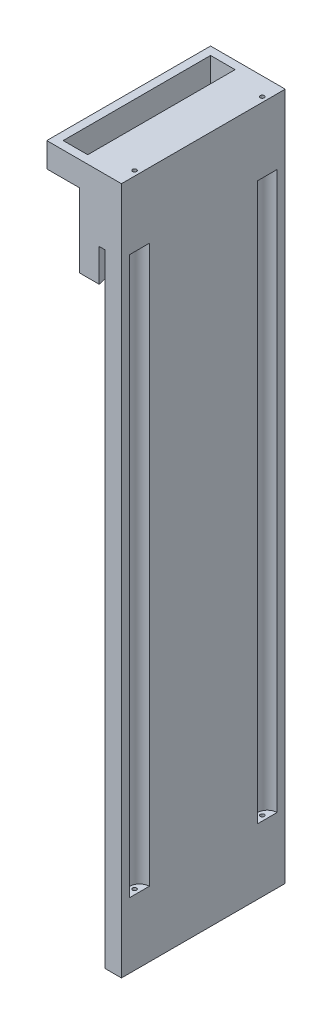
ISO-10303-21;
HEADER;
FILE_DESCRIPTION(('STEP AP214'),'2;1');
FILE_NAME('part.step','',(''),(''),'','','');
FILE_SCHEMA(('AUTOMOTIVE_DESIGN { 1 0 10303 214 1 1 1 1 }'));
ENDSEC;
DATA;
#1=APPLICATION_CONTEXT('core data for automotive mechanical design processes');
#2=APPLICATION_PROTOCOL_DEFINITION('international standard','automotive_design',2000,#1);
#3=PRODUCT_CONTEXT('',#1,'mechanical');
#4=PRODUCT('Part','Part','',(#3));
#5=PRODUCT_RELATED_PRODUCT_CATEGORY('part','',(#4));
#6=PRODUCT_DEFINITION_FORMATION('','',#4);
#7=PRODUCT_DEFINITION_CONTEXT('part definition',#1,'design');
#8=PRODUCT_DEFINITION('design','',#6,#7);
#9=PRODUCT_DEFINITION_SHAPE('','',#8);
#10=(LENGTH_UNIT() NAMED_UNIT(*) SI_UNIT(.MILLI.,.METRE.));
#11=(NAMED_UNIT(*) PLANE_ANGLE_UNIT() SI_UNIT($,.RADIAN.));
#12=(NAMED_UNIT(*) SI_UNIT($,.STERADIAN.) SOLID_ANGLE_UNIT());
#13=UNCERTAINTY_MEASURE_WITH_UNIT(LENGTH_MEASURE(1.E-05),#10,'distance_accuracy_value','');
#14=(GEOMETRIC_REPRESENTATION_CONTEXT(3) GLOBAL_UNCERTAINTY_ASSIGNED_CONTEXT((#13)) GLOBAL_UNIT_ASSIGNED_CONTEXT((#10,
#11,#12)) REPRESENTATION_CONTEXT('',''));
#15=CARTESIAN_POINT('',(0.,0.,0.));
#16=DIRECTION('',(0.,0.,1.));
#17=DIRECTION('',(1.,0.,0.));
#18=AXIS2_PLACEMENT_3D('',#15,#16,#17);
#19=CARTESIAN_POINT('',(0.,0.,50.));
#20=DIRECTION('',(1.,0.,0.));
#21=DIRECTION('',(0.,0.,-1.));
#22=AXIS2_PLACEMENT_3D('',#19,#20,#21);
#23=PLANE('',#22);
#24=DIRECTION('',(0.,0.,1.));
#25=VECTOR('',#24,1.);
#26=CARTESIAN_POINT('',(0.,22.5,0.));
#27=LINE('',#26,#25);
#28=CARTESIAN_POINT('',(0.,22.5,0.));
#29=VERTEX_POINT('',#28);
#30=CARTESIAN_POINT('',(0.,22.5,2.5));
#31=VERTEX_POINT('',#30);
#32=EDGE_CURVE('E251',#29,#31,#27,.T.);
#33=ORIENTED_EDGE('',*,*,#32,.F.);
#34=DIRECTION('',(0.,-1.,0.));
#35=VECTOR('',#34,1.);
#36=CARTESIAN_POINT('',(0.,0.,0.));
#37=LINE('',#36,#35);
#38=CARTESIAN_POINT('',(0.,0.,0.));
#39=VERTEX_POINT('',#38);
#40=EDGE_CURVE('E289',#29,#39,#37,.T.);
#41=ORIENTED_EDGE('',*,*,#40,.T.);
#42=DIRECTION('',(0.,0.,-1.));
#43=VECTOR('',#42,1.);
#44=CARTESIAN_POINT('',(0.,0.,50.));
#45=LINE('',#44,#43);
#46=CARTESIAN_POINT('',(0.,0.,50.));
#47=VERTEX_POINT('',#46);
#48=EDGE_CURVE('E302',#47,#39,#45,.T.);
#49=ORIENTED_EDGE('',*,*,#48,.F.);
#50=DIRECTION('',(0.,-1.,0.));
#51=VECTOR('',#50,1.);
#52=CARTESIAN_POINT('',(0.,0.,50.));
#53=LINE('',#52,#51);
#54=CARTESIAN_POINT('',(0.,22.5,50.));
#55=VERTEX_POINT('',#54);
#56=EDGE_CURVE('E300',#55,#47,#53,.T.);
#57=ORIENTED_EDGE('',*,*,#56,.F.);
#58=CARTESIAN_POINT('',(0.,22.5,47.5));
#59=VERTEX_POINT('',#58);
#60=EDGE_CURVE('E246',#59,#55,#27,.T.);
#61=ORIENTED_EDGE('',*,*,#60,.F.);
#62=DIRECTION('',(0.,-1.,0.));
#63=VECTOR('',#62,1.);
#64=CARTESIAN_POINT('',(0.,32.5,47.5));
#65=LINE('',#64,#63);
#66=CARTESIAN_POINT('',(0.,30.,47.5));
#67=VERTEX_POINT('',#66);
#68=EDGE_CURVE('E226',#67,#59,#65,.T.);
#69=ORIENTED_EDGE('',*,*,#68,.F.);
#70=DIRECTION('',(0.,0.,1.));
#71=VECTOR('',#70,1.);
#72=CARTESIAN_POINT('',(0.,30.,50.));
#73=LINE('',#72,#71);
#74=CARTESIAN_POINT('',(0.,30.,2.5));
#75=VERTEX_POINT('',#74);
#76=EDGE_CURVE('E243',#75,#67,#73,.T.);
#77=ORIENTED_EDGE('',*,*,#76,.F.);
#78=DIRECTION('',(0.,-1.,0.));
#79=VECTOR('',#78,1.);
#80=CARTESIAN_POINT('',(0.,32.5,2.5));
#81=LINE('',#80,#79);
#82=EDGE_CURVE('E227',#75,#31,#81,.T.);
#83=ORIENTED_EDGE('',*,*,#82,.T.);
#84=EDGE_LOOP('',(#33,#41,#49,#57,#61,#69,#77,#83));
#85=FACE_BOUND('',#84,.T.);
#86=ADVANCED_FACE('F41',(#85),#23,.F.);
#87=CARTESIAN_POINT('',(6.,0.,50.));
#88=DIRECTION('',(0.,1.,0.));
#89=DIRECTION('',(-1.,0.,0.));
#90=AXIS2_PLACEMENT_3D('',#87,#88,#89);
#91=PLANE('',#90);
#92=DIRECTION('',(1.,0.,0.));
#93=VECTOR('',#92,1.);
#94=CARTESIAN_POINT('',(6.,0.,0.));
#95=LINE('',#94,#93);
#96=CARTESIAN_POINT('',(6.,0.,0.));
#97=VERTEX_POINT('',#96);
#98=EDGE_CURVE('E284',#39,#97,#95,.T.);
#99=ORIENTED_EDGE('',*,*,#98,.T.);
#100=CARTESIAN_POINT('',(99.3089491956693,0.,25.));
#101=DIRECTION('',(0.,-1.,0.));
#102=DIRECTION('',(1.,0.,0.));
#103=AXIS2_PLACEMENT_3D('',#100,#101,#102);
#104=CIRCLE('',#103,96.6);
#105=CARTESIAN_POINT('',(6.,0.,50.));
#106=VERTEX_POINT('',#105);
#107=EDGE_CURVE('E267',#106,#97,#104,.T.);
#108=ORIENTED_EDGE('',*,*,#107,.F.);
#109=DIRECTION('',(1.,0.,0.));
#110=VECTOR('',#109,1.);
#111=CARTESIAN_POINT('',(6.,0.,50.));
#112=LINE('',#111,#110);
#113=EDGE_CURVE('E285',#47,#106,#112,.T.);
#114=ORIENTED_EDGE('',*,*,#113,.F.);
#115=ORIENTED_EDGE('',*,*,#48,.T.);
#116=EDGE_LOOP('',(#99,#108,#114,#115));
#117=FACE_BOUND('',#116,.T.);
#118=ADVANCED_FACE('F43',(#117),#91,.F.);
#119=CARTESIAN_POINT('',(7.8,10.,50.));
#120=DIRECTION('',(0.,1.,0.));
#121=DIRECTION('',(-1.,0.,0.));
#122=AXIS2_PLACEMENT_3D('',#119,#120,#121);
#123=PLANE('',#122);
#124=DIRECTION('',(1.,0.,0.));
#125=VECTOR('',#124,1.);
#126=CARTESIAN_POINT('',(7.8,10.,0.));
#127=LINE('',#126,#125);
#128=CARTESIAN_POINT('',(6.,10.,0.));
#129=VERTEX_POINT('',#128);
#130=CARTESIAN_POINT('',(7.8,10.,0.));
#131=VERTEX_POINT('',#130);
#132=EDGE_CURVE('E307',#129,#131,#127,.T.);
#133=ORIENTED_EDGE('',*,*,#132,.T.);
#134=DIRECTION('',(0.,0.,-1.));
#135=VECTOR('',#134,1.);
#136=CARTESIAN_POINT('',(7.8,10.,50.));
#137=LINE('',#136,#135);
#138=CARTESIAN_POINT('',(7.8,10.,50.));
#139=VERTEX_POINT('',#138);
#140=EDGE_CURVE('E11',#139,#131,#137,.T.);
#141=ORIENTED_EDGE('',*,*,#140,.F.);
#142=DIRECTION('',(1.,0.,0.));
#143=VECTOR('',#142,1.);
#144=CARTESIAN_POINT('',(7.8,10.,50.));
#145=LINE('',#144,#143);
#146=CARTESIAN_POINT('',(6.,10.,50.));
#147=VERTEX_POINT('',#146);
#148=EDGE_CURVE('E292',#147,#139,#145,.T.);
#149=ORIENTED_EDGE('',*,*,#148,.F.);
#150=CARTESIAN_POINT('',(99.3089491956693,10.,25.));
#151=DIRECTION('',(0.,-1.,0.));
#152=DIRECTION('',(1.,0.,0.));
#153=AXIS2_PLACEMENT_3D('',#150,#151,#152);
#154=CIRCLE('',#153,96.6);
#155=EDGE_CURVE('E268',#147,#129,#154,.T.);
#156=ORIENTED_EDGE('',*,*,#155,.T.);
#157=EDGE_LOOP('',(#133,#141,#149,#156));
#158=FACE_BOUND('',#157,.T.);
#159=ADVANCED_FACE('F347',(#158),#123,.F.);
#160=CARTESIAN_POINT('',(7.8,0.,50.));
#161=DIRECTION('',(1.,0.,0.));
#162=DIRECTION('',(0.,0.,-1.));
#163=AXIS2_PLACEMENT_3D('',#160,#161,#162);
#164=PLANE('',#163);
#165=DIRECTION('',(0.,-1.,0.));
#166=VECTOR('',#165,1.);
#167=CARTESIAN_POINT('',(7.8,0.,0.));
#168=LINE('',#167,#166);
#169=CARTESIAN_POINT('',(7.80000000000001,-180.,0.));
#170=VERTEX_POINT('',#169);
#171=EDGE_CURVE('E309',#131,#170,#168,.T.);
#172=ORIENTED_EDGE('',*,*,#171,.T.);
#173=DIRECTION('',(0.,0.,-1.));
#174=VECTOR('',#173,1.);
#175=CARTESIAN_POINT('',(7.80000000000001,-180.,0.));
#176=LINE('',#175,#174);
#177=CARTESIAN_POINT('',(7.80000000000001,-180.,50.));
#178=VERTEX_POINT('',#177);
#179=EDGE_CURVE('E271',#178,#170,#176,.T.);
#180=ORIENTED_EDGE('',*,*,#179,.F.);
#181=DIRECTION('',(0.,-1.,0.));
#182=VECTOR('',#181,1.);
#183=CARTESIAN_POINT('',(7.8,0.,50.));
#184=LINE('',#183,#182);
#185=EDGE_CURVE('E294',#139,#178,#184,.T.);
#186=ORIENTED_EDGE('',*,*,#185,.F.);
#187=ORIENTED_EDGE('',*,*,#140,.T.);
#188=EDGE_LOOP('',(#172,#180,#186,#187));
#189=FACE_BOUND('',#188,.T.);
#190=ADVANCED_FACE('F360',(#189),#164,.F.);
#191=CARTESIAN_POINT('',(12.8,30.,50.));
#192=DIRECTION('',(-1.,0.,0.));
#193=DIRECTION('',(0.,-1.,0.));
#194=AXIS2_PLACEMENT_3D('',#191,#192,#193);
#195=PLANE('',#194);
#196=DIRECTION('',(0.,1.,0.));
#197=VECTOR('',#196,1.);
#198=CARTESIAN_POINT('',(12.8,-160.,2.50009450023526));
#199=LINE('',#198,#197);
#200=CARTESIAN_POINT('',(12.8,-160.,2.50009450023526));
#201=VERTEX_POINT('',#200);
#202=CARTESIAN_POINT('',(12.8,10.,2.50009450023526));
#203=VERTEX_POINT('',#202);
#204=EDGE_CURVE('E175',#201,#203,#199,.T.);
#205=ORIENTED_EDGE('',*,*,#204,.F.);
#206=DIRECTION('',(0.,0.,-1.));
#207=VECTOR('',#206,1.);
#208=CARTESIAN_POINT('',(12.8,-160.,2.50009450023526));
#209=LINE('',#208,#207);
#210=CARTESIAN_POINT('',(12.8,-160.,8.5));
#211=VERTEX_POINT('',#210);
#212=EDGE_CURVE('E176',#211,#201,#209,.T.);
#213=ORIENTED_EDGE('',*,*,#212,.F.);
#214=DIRECTION('',(0.,1.,0.));
#215=VECTOR('',#214,1.);
#216=CARTESIAN_POINT('',(12.8,-160.,8.5));
#217=LINE('',#216,#215);
#218=CARTESIAN_POINT('',(12.8,10.,8.5));
#219=VERTEX_POINT('',#218);
#220=EDGE_CURVE('E167',#211,#219,#217,.T.);
#221=ORIENTED_EDGE('',*,*,#220,.T.);
#222=DIRECTION('',(0.,0.,-1.));
#223=VECTOR('',#222,1.);
#224=CARTESIAN_POINT('',(12.8,10.,2.50009450023526));
#225=LINE('',#224,#223);
#226=EDGE_CURVE('E181',#219,#203,#225,.T.);
#227=ORIENTED_EDGE('',*,*,#226,.T.);
#228=EDGE_LOOP('',(#205,#213,#221,#227));
#229=FACE_BOUND('',#228,.T.);
#230=DIRECTION('',(0.,1.,0.));
#231=VECTOR('',#230,1.);
#232=CARTESIAN_POINT('',(12.8,-160.,41.5000945002353));
#233=LINE('',#232,#231);
#234=CARTESIAN_POINT('',(12.8,-160.,41.5000945002353));
#235=VERTEX_POINT('',#234);
#236=CARTESIAN_POINT('',(12.8,10.,41.5000945002353));
#237=VERTEX_POINT('',#236);
#238=EDGE_CURVE('E213',#235,#237,#233,.T.);
#239=ORIENTED_EDGE('',*,*,#238,.F.);
#240=DIRECTION('',(0.,0.,-1.));
#241=VECTOR('',#240,1.);
#242=CARTESIAN_POINT('',(12.8,-160.,41.5000945002353));
#243=LINE('',#242,#241);
#244=CARTESIAN_POINT('',(12.8,-160.,47.5));
#245=VERTEX_POINT('',#244);
#246=EDGE_CURVE('E205',#245,#235,#243,.T.);
#247=ORIENTED_EDGE('',*,*,#246,.F.);
#248=DIRECTION('',(0.,1.,0.));
#249=VECTOR('',#248,1.);
#250=CARTESIAN_POINT('',(12.8,-160.,47.5));
#251=LINE('',#250,#249);
#252=CARTESIAN_POINT('',(12.8,10.,47.5));
#253=VERTEX_POINT('',#252);
#254=EDGE_CURVE('E209',#245,#253,#251,.T.);
#255=ORIENTED_EDGE('',*,*,#254,.T.);
#256=DIRECTION('',(0.,0.,-1.));
#257=VECTOR('',#256,1.);
#258=CARTESIAN_POINT('',(12.8,10.,41.5000945002353));
#259=LINE('',#258,#257);
#260=EDGE_CURVE('E206',#253,#237,#259,.T.);
#261=ORIENTED_EDGE('',*,*,#260,.T.);
#262=EDGE_LOOP('',(#239,#247,#255,#261));
#263=FACE_BOUND('',#262,.T.);
#264=DIRECTION('',(0.,1.,0.));
#265=VECTOR('',#264,1.);
#266=CARTESIAN_POINT('',(12.8,30.,0.));
#267=LINE('',#266,#265);
#268=CARTESIAN_POINT('',(12.8,-180.,0.));
#269=VERTEX_POINT('',#268);
#270=CARTESIAN_POINT('',(12.8,30.,0.));
#271=VERTEX_POINT('',#270);
#272=EDGE_CURVE('E311',#269,#271,#267,.T.);
#273=ORIENTED_EDGE('',*,*,#272,.T.);
#274=DIRECTION('',(0.,0.,-1.));
#275=VECTOR('',#274,1.);
#276=CARTESIAN_POINT('',(12.8,30.,50.));
#277=LINE('',#276,#275);
#278=CARTESIAN_POINT('',(12.8,30.,50.));
#279=VERTEX_POINT('',#278);
#280=EDGE_CURVE('E50',#279,#271,#277,.T.);
#281=ORIENTED_EDGE('',*,*,#280,.F.);
#282=DIRECTION('',(0.,1.,0.));
#283=VECTOR('',#282,1.);
#284=CARTESIAN_POINT('',(12.8,30.,50.));
#285=LINE('',#284,#283);
#286=CARTESIAN_POINT('',(12.8,-180.,50.));
#287=VERTEX_POINT('',#286);
#288=EDGE_CURVE('E296',#287,#279,#285,.T.);
#289=ORIENTED_EDGE('',*,*,#288,.F.);
#290=DIRECTION('',(0.,0.,1.));
#291=VECTOR('',#290,1.);
#292=CARTESIAN_POINT('',(12.8,-180.,50.));
#293=LINE('',#292,#291);
#294=EDGE_CURVE('E278',#269,#287,#293,.T.);
#295=ORIENTED_EDGE('',*,*,#294,.F.);
#296=EDGE_LOOP('',(#273,#281,#289,#295));
#297=FACE_BOUND('',#296,.T.);
#298=ADVANCED_FACE('F183',(#229,#263,#297),#195,.F.);
#299=CARTESIAN_POINT('',(0.,30.,50.));
#300=DIRECTION('',(0.,-1.,0.));
#301=DIRECTION('',(0.,0.,-1.));
#302=AXIS2_PLACEMENT_3D('',#299,#300,#301);
#303=PLANE('',#302);
#304=CARTESIAN_POINT('',(11.3,30.,5.50000000000001));
#305=DIRECTION('',(0.,1.,0.));
#306=DIRECTION('',(0.,0.,1.));
#307=AXIS2_PLACEMENT_3D('',#304,#305,#306);
#308=CIRCLE('',#307,0.600000000000008);
#309=CARTESIAN_POINT('',(11.3,30.,6.10000000000001));
#310=VERTEX_POINT('',#309);
#311=EDGE_CURVE('E574',#310,#310,#308,.T.);
#312=ORIENTED_EDGE('',*,*,#311,.F.);
#313=EDGE_LOOP('',(#312));
#314=FACE_BOUND('',#313,.T.);
#315=CARTESIAN_POINT('',(11.3,30.,44.5));
#316=DIRECTION('',(0.,1.,0.));
#317=DIRECTION('',(0.,0.,1.));
#318=AXIS2_PLACEMENT_3D('',#315,#316,#317);
#319=CIRCLE('',#318,0.600000000000008);
#320=CARTESIAN_POINT('',(11.3,30.,45.1));
#321=VERTEX_POINT('',#320);
#322=EDGE_CURVE('E191',#321,#321,#319,.T.);
#323=ORIENTED_EDGE('',*,*,#322,.F.);
#324=EDGE_LOOP('',(#323));
#325=FACE_BOUND('',#324,.T.);
#326=DIRECTION('',(1.,0.,0.));
#327=VECTOR('',#326,1.);
#328=CARTESIAN_POINT('',(0.,30.,2.5));
#329=LINE('',#328,#327);
#330=CARTESIAN_POINT('',(-7.49999999999999,30.,2.5));
#331=VERTEX_POINT('',#330);
#332=EDGE_CURVE('E240',#331,#75,#329,.T.);
#333=ORIENTED_EDGE('',*,*,#332,.T.);
#334=ORIENTED_EDGE('',*,*,#76,.T.);
#335=DIRECTION('',(-1.,0.,0.));
#336=VECTOR('',#335,1.);
#337=CARTESIAN_POINT('',(0.,30.,47.5));
#338=LINE('',#337,#336);
#339=CARTESIAN_POINT('',(-7.5,30.,47.5));
#340=VERTEX_POINT('',#339);
#341=EDGE_CURVE('E229',#67,#340,#338,.T.);
#342=ORIENTED_EDGE('',*,*,#341,.T.);
#343=DIRECTION('',(0.,0.,-1.));
#344=VECTOR('',#343,1.);
#345=CARTESIAN_POINT('',(-7.5,30.,50.));
#346=LINE('',#345,#344);
#347=EDGE_CURVE('E237',#340,#331,#346,.T.);
#348=ORIENTED_EDGE('',*,*,#347,.T.);
#349=EDGE_LOOP('',(#333,#334,#342,#348));
#350=FACE_BOUND('',#349,.T.);
#351=DIRECTION('',(-1.,0.,0.));
#352=VECTOR('',#351,1.);
#353=CARTESIAN_POINT('',(0.,30.,0.));
#354=LINE('',#353,#352);
#355=CARTESIAN_POINT('',(-10.,30.,0.));
#356=VERTEX_POINT('',#355);
#357=EDGE_CURVE('E313',#271,#356,#354,.T.);
#358=ORIENTED_EDGE('',*,*,#357,.T.);
#359=DIRECTION('',(0.,0.,-1.));
#360=VECTOR('',#359,1.);
#361=CARTESIAN_POINT('',(-10.,30.,0.));
#362=LINE('',#361,#360);
#363=CARTESIAN_POINT('',(-10.,30.,50.));
#364=VERTEX_POINT('',#363);
#365=EDGE_CURVE('E256',#364,#356,#362,.T.);
#366=ORIENTED_EDGE('',*,*,#365,.F.);
#367=DIRECTION('',(-1.,0.,0.));
#368=VECTOR('',#367,1.);
#369=CARTESIAN_POINT('',(0.,30.,50.));
#370=LINE('',#369,#368);
#371=EDGE_CURVE('E298',#279,#364,#370,.T.);
#372=ORIENTED_EDGE('',*,*,#371,.F.);
#373=ORIENTED_EDGE('',*,*,#280,.T.);
#374=EDGE_LOOP('',(#358,#366,#372,#373));
#375=FACE_BOUND('',#374,.T.);
#376=ADVANCED_FACE('F353',(#314,#325,#350,#375),#303,.F.);
#377=CARTESIAN_POINT('',(0.,0.,50.));
#378=DIRECTION('',(0.,0.,-1.));
#379=DIRECTION('',(-1.,0.,0.));
#380=AXIS2_PLACEMENT_3D('',#377,#378,#379);
#381=PLANE('',#380);
#382=ORIENTED_EDGE('',*,*,#113,.T.);
#383=DIRECTION('',(0.,1.,0.));
#384=VECTOR('',#383,1.);
#385=CARTESIAN_POINT('',(6.,10.,50.));
#386=LINE('',#385,#384);
#387=EDGE_CURVE('E288',#106,#147,#386,.T.);
#388=ORIENTED_EDGE('',*,*,#387,.T.);
#389=ORIENTED_EDGE('',*,*,#148,.T.);
#390=ORIENTED_EDGE('',*,*,#185,.T.);
#391=DIRECTION('',(-1.,0.,0.));
#392=VECTOR('',#391,1.);
#393=CARTESIAN_POINT('',(7.80000000000001,-180.,50.));
#394=LINE('',#393,#392);
#395=EDGE_CURVE('E281',#287,#178,#394,.T.);
#396=ORIENTED_EDGE('',*,*,#395,.F.);
#397=ORIENTED_EDGE('',*,*,#288,.T.);
#398=ORIENTED_EDGE('',*,*,#371,.T.);
#399=DIRECTION('',(0.,1.,0.));
#400=VECTOR('',#399,1.);
#401=CARTESIAN_POINT('',(-10.,30.,50.));
#402=LINE('',#401,#400);
#403=CARTESIAN_POINT('',(-10.,22.5,50.));
#404=VERTEX_POINT('',#403);
#405=EDGE_CURVE('E253',#404,#364,#402,.T.);
#406=ORIENTED_EDGE('',*,*,#405,.F.);
#407=DIRECTION('',(1.,0.,0.));
#408=VECTOR('',#407,1.);
#409=CARTESIAN_POINT('',(-10.,22.5,50.));
#410=LINE('',#409,#408);
#411=EDGE_CURVE('E259',#404,#55,#410,.T.);
#412=ORIENTED_EDGE('',*,*,#411,.T.);
#413=ORIENTED_EDGE('',*,*,#56,.T.);
#414=EDGE_LOOP('',(#382,#388,#389,#390,#396,#397,#398,#406,#412,#413));
#415=FACE_BOUND('',#414,.T.);
#416=ADVANCED_FACE('F356',(#415),#381,.F.);
#417=CARTESIAN_POINT('',(0.,0.,0.));
#418=DIRECTION('',(0.,0.,-1.));
#419=DIRECTION('',(-1.,0.,0.));
#420=AXIS2_PLACEMENT_3D('',#417,#418,#419);
#421=PLANE('',#420);
#422=ORIENTED_EDGE('',*,*,#98,.F.);
#423=ORIENTED_EDGE('',*,*,#40,.F.);
#424=DIRECTION('',(1.,0.,0.));
#425=VECTOR('',#424,1.);
#426=CARTESIAN_POINT('',(-10.,22.5,0.));
#427=LINE('',#426,#425);
#428=CARTESIAN_POINT('',(-10.,22.5,0.));
#429=VERTEX_POINT('',#428);
#430=EDGE_CURVE('E264',#429,#29,#427,.T.);
#431=ORIENTED_EDGE('',*,*,#430,.F.);
#432=DIRECTION('',(0.,-1.,0.));
#433=VECTOR('',#432,1.);
#434=CARTESIAN_POINT('',(-10.,30.,0.));
#435=LINE('',#434,#433);
#436=EDGE_CURVE('E247',#356,#429,#435,.T.);
#437=ORIENTED_EDGE('',*,*,#436,.F.);
#438=ORIENTED_EDGE('',*,*,#357,.F.);
#439=ORIENTED_EDGE('',*,*,#272,.F.);
#440=DIRECTION('',(1.,0.,0.));
#441=VECTOR('',#440,1.);
#442=CARTESIAN_POINT('',(12.8,-180.,0.));
#443=LINE('',#442,#441);
#444=EDGE_CURVE('E275',#170,#269,#443,.T.);
#445=ORIENTED_EDGE('',*,*,#444,.F.);
#446=ORIENTED_EDGE('',*,*,#171,.F.);
#447=ORIENTED_EDGE('',*,*,#132,.F.);
#448=DIRECTION('',(0.,1.,0.));
#449=VECTOR('',#448,1.);
#450=CARTESIAN_POINT('',(6.,10.,0.));
#451=LINE('',#450,#449);
#452=EDGE_CURVE('E305',#97,#129,#451,.T.);
#453=ORIENTED_EDGE('',*,*,#452,.F.);
#454=EDGE_LOOP('',(#422,#423,#431,#437,#438,#439,#445,#446,#447,#453));
#455=FACE_BOUND('',#454,.T.);
#456=ADVANCED_FACE('F351',(#455),#421,.T.);
#457=CARTESIAN_POINT('',(0.,-180.,0.));
#458=DIRECTION('',(0.,1.,0.));
#459=DIRECTION('',(-1.,0.,0.));
#460=AXIS2_PLACEMENT_3D('',#457,#458,#459);
#461=PLANE('',#460);
#462=ORIENTED_EDGE('',*,*,#179,.T.);
#463=ORIENTED_EDGE('',*,*,#444,.T.);
#464=ORIENTED_EDGE('',*,*,#294,.T.);
#465=ORIENTED_EDGE('',*,*,#395,.T.);
#466=EDGE_LOOP('',(#462,#463,#464,#465));
#467=FACE_BOUND('',#466,.T.);
#468=ADVANCED_FACE('F381',(#467),#461,.F.);
#469=CARTESIAN_POINT('',(99.3089491956693,10.,25.));
#470=DIRECTION('',(0.,-1.,0.));
#471=DIRECTION('',(1.,0.,0.));
#472=AXIS2_PLACEMENT_3D('',#469,#470,#471);
#473=CYLINDRICAL_SURFACE('',#472,96.6);
#474=ORIENTED_EDGE('',*,*,#107,.T.);
#475=ORIENTED_EDGE('',*,*,#452,.T.);
#476=ORIENTED_EDGE('',*,*,#155,.F.);
#477=ORIENTED_EDGE('',*,*,#387,.F.);
#478=EDGE_LOOP('',(#474,#475,#476,#477));
#479=FACE_BOUND('',#478,.T.);
#480=ADVANCED_FACE('F388',(#479),#473,.F.);
#481=CARTESIAN_POINT('',(-10.,22.5,0.));
#482=DIRECTION('',(0.,1.,0.));
#483=DIRECTION('',(0.,0.,1.));
#484=AXIS2_PLACEMENT_3D('',#481,#482,#483);
#485=PLANE('',#484);
#486=ORIENTED_EDGE('',*,*,#32,.T.);
#487=DIRECTION('',(1.,0.,0.));
#488=VECTOR('',#487,1.);
#489=CARTESIAN_POINT('',(0.,22.5,2.5));
#490=LINE('',#489,#488);
#491=CARTESIAN_POINT('',(-7.49999999999999,22.5,2.5));
#492=VERTEX_POINT('',#491);
#493=EDGE_CURVE('E223',#492,#31,#490,.T.);
#494=ORIENTED_EDGE('',*,*,#493,.F.);
#495=DIRECTION('',(0.,0.,-1.));
#496=VECTOR('',#495,1.);
#497=CARTESIAN_POINT('',(-7.5,22.5,47.5));
#498=LINE('',#497,#496);
#499=CARTESIAN_POINT('',(-7.5,22.5,47.5));
#500=VERTEX_POINT('',#499);
#501=EDGE_CURVE('E220',#500,#492,#498,.T.);
#502=ORIENTED_EDGE('',*,*,#501,.F.);
#503=DIRECTION('',(-1.,0.,0.));
#504=VECTOR('',#503,1.);
#505=CARTESIAN_POINT('',(0.,22.5,47.5));
#506=LINE('',#505,#504);
#507=EDGE_CURVE('E215',#59,#500,#506,.T.);
#508=ORIENTED_EDGE('',*,*,#507,.F.);
#509=ORIENTED_EDGE('',*,*,#60,.T.);
#510=ORIENTED_EDGE('',*,*,#411,.F.);
#511=DIRECTION('',(0.,0.,1.));
#512=VECTOR('',#511,1.);
#513=CARTESIAN_POINT('',(-10.,22.5,0.));
#514=LINE('',#513,#512);
#515=EDGE_CURVE('E250',#429,#404,#514,.T.);
#516=ORIENTED_EDGE('',*,*,#515,.F.);
#517=ORIENTED_EDGE('',*,*,#430,.T.);
#518=EDGE_LOOP('',(#486,#494,#502,#508,#509,#510,#516,#517));
#519=FACE_BOUND('',#518,.T.);
#520=ADVANCED_FACE('F394',(#519),#485,.F.);
#521=CARTESIAN_POINT('',(-10.,0.,0.));
#522=DIRECTION('',(-1.,0.,0.));
#523=DIRECTION('',(0.,0.,1.));
#524=AXIS2_PLACEMENT_3D('',#521,#522,#523);
#525=PLANE('',#524);
#526=ORIENTED_EDGE('',*,*,#436,.T.);
#527=ORIENTED_EDGE('',*,*,#515,.T.);
#528=ORIENTED_EDGE('',*,*,#405,.T.);
#529=ORIENTED_EDGE('',*,*,#365,.T.);
#530=EDGE_LOOP('',(#526,#527,#528,#529));
#531=FACE_BOUND('',#530,.T.);
#532=ADVANCED_FACE('F399',(#531),#525,.T.);
#533=CARTESIAN_POINT('',(0.,32.5,2.5));
#534=DIRECTION('',(0.,0.,-1.));
#535=DIRECTION('',(-1.,0.,0.));
#536=AXIS2_PLACEMENT_3D('',#533,#534,#535);
#537=PLANE('',#536);
#538=DIRECTION('',(0.,-1.,0.));
#539=VECTOR('',#538,1.);
#540=CARTESIAN_POINT('',(-7.49999999999999,32.5,2.5));
#541=LINE('',#540,#539);
#542=EDGE_CURVE('E230',#331,#492,#541,.T.);
#543=ORIENTED_EDGE('',*,*,#542,.T.);
#544=ORIENTED_EDGE('',*,*,#493,.T.);
#545=ORIENTED_EDGE('',*,*,#82,.F.);
#546=ORIENTED_EDGE('',*,*,#332,.F.);
#547=EDGE_LOOP('',(#543,#544,#545,#546));
#548=FACE_BOUND('',#547,.T.);
#549=ADVANCED_FACE('F415',(#548),#537,.F.);
#550=CARTESIAN_POINT('',(-7.5,32.5,47.5));
#551=DIRECTION('',(-1.,0.,0.));
#552=DIRECTION('',(0.,0.,1.));
#553=AXIS2_PLACEMENT_3D('',#550,#551,#552);
#554=PLANE('',#553);
#555=DIRECTION('',(0.,-1.,0.));
#556=VECTOR('',#555,1.);
#557=CARTESIAN_POINT('',(-7.5,32.5,47.5));
#558=LINE('',#557,#556);
#559=EDGE_CURVE('E232',#340,#500,#558,.T.);
#560=ORIENTED_EDGE('',*,*,#559,.T.);
#561=ORIENTED_EDGE('',*,*,#501,.T.);
#562=ORIENTED_EDGE('',*,*,#542,.F.);
#563=ORIENTED_EDGE('',*,*,#347,.F.);
#564=EDGE_LOOP('',(#560,#561,#562,#563));
#565=FACE_BOUND('',#564,.T.);
#566=ADVANCED_FACE('F418',(#565),#554,.F.);
#567=CARTESIAN_POINT('',(0.,32.5,47.5));
#568=DIRECTION('',(0.,0.,1.));
#569=DIRECTION('',(1.,0.,0.));
#570=AXIS2_PLACEMENT_3D('',#567,#568,#569);
#571=PLANE('',#570);
#572=ORIENTED_EDGE('',*,*,#68,.T.);
#573=ORIENTED_EDGE('',*,*,#507,.T.);
#574=ORIENTED_EDGE('',*,*,#559,.F.);
#575=ORIENTED_EDGE('',*,*,#341,.F.);
#576=EDGE_LOOP('',(#572,#573,#574,#575));
#577=FACE_BOUND('',#576,.T.);
#578=ADVANCED_FACE('F410',(#577),#571,.F.);
#579=CARTESIAN_POINT('',(12.8168374129013,-160.,44.5000472501176));
#580=DIRECTION('',(0.,1.,0.));
#581=DIRECTION('',(0.,0.,1.));
#582=AXIS2_PLACEMENT_3D('',#579,#580,#581);
#583=CYLINDRICAL_SURFACE('',#582,3.);
#584=CARTESIAN_POINT('',(12.8168374129013,10.,44.5000472501176));
#585=DIRECTION('',(0.,1.,0.));
#586=DIRECTION('',(0.,0.,-1.));
#587=AXIS2_PLACEMENT_3D('',#584,#585,#586);
#588=CIRCLE('',#587,3.);
#589=EDGE_CURVE('E64',#237,#253,#588,.T.);
#590=ORIENTED_EDGE('',*,*,#589,.T.);
#591=ORIENTED_EDGE('',*,*,#254,.F.);
#592=CARTESIAN_POINT('',(12.8168374129013,-160.,44.5000472501176));
#593=DIRECTION('',(0.,1.,0.));
#594=DIRECTION('',(0.,0.,-1.));
#595=AXIS2_PLACEMENT_3D('',#592,#593,#594);
#596=CIRCLE('',#595,3.);
#597=EDGE_CURVE('E202',#235,#245,#596,.T.);
#598=ORIENTED_EDGE('',*,*,#597,.F.);
#599=ORIENTED_EDGE('',*,*,#238,.T.);
#600=EDGE_LOOP('',(#590,#591,#598,#599));
#601=FACE_BOUND('',#600,.T.);
#602=ADVANCED_FACE('F335',(#601),#583,.F.);
#603=CARTESIAN_POINT('',(12.8168374129013,-160.,44.5000472501176));
#604=DIRECTION('',(0.,-1.,0.));
#605=DIRECTION('',(0.,0.,-1.));
#606=AXIS2_PLACEMENT_3D('',#603,#604,#605);
#607=PLANE('',#606);
#608=CARTESIAN_POINT('',(11.3,-160.,44.5));
#609=DIRECTION('',(0.,-1.,0.));
#610=DIRECTION('',(0.,0.,-1.));
#611=AXIS2_PLACEMENT_3D('',#608,#609,#610);
#612=CIRCLE('',#611,0.600000000000008);
#613=CARTESIAN_POINT('',(11.3,-160.,43.9));
#614=VERTEX_POINT('',#613);
#615=EDGE_CURVE('E199',#614,#614,#612,.T.);
#616=ORIENTED_EDGE('',*,*,#615,.T.);
#617=EDGE_LOOP('',(#616));
#618=FACE_BOUND('',#617,.T.);
#619=ORIENTED_EDGE('',*,*,#597,.T.);
#620=ORIENTED_EDGE('',*,*,#246,.T.);
#621=EDGE_LOOP('',(#619,#620));
#622=FACE_BOUND('',#621,.T.);
#623=ADVANCED_FACE('F327',(#618,#622),#607,.F.);
#624=CARTESIAN_POINT('',(12.8168374129013,10.,44.5000472501176));
#625=DIRECTION('',(0.,-1.,0.));
#626=DIRECTION('',(0.,0.,-1.));
#627=AXIS2_PLACEMENT_3D('',#624,#625,#626);
#628=PLANE('',#627);
#629=CARTESIAN_POINT('',(11.3,10.,44.5));
#630=DIRECTION('',(0.,-1.,0.));
#631=DIRECTION('',(0.,0.,-1.));
#632=AXIS2_PLACEMENT_3D('',#629,#630,#631);
#633=CIRCLE('',#632,0.600000000000008);
#634=CARTESIAN_POINT('',(11.3,10.,43.9));
#635=VERTEX_POINT('',#634);
#636=EDGE_CURVE('E196',#635,#635,#633,.T.);
#637=ORIENTED_EDGE('',*,*,#636,.F.);
#638=EDGE_LOOP('',(#637));
#639=FACE_BOUND('',#638,.T.);
#640=ORIENTED_EDGE('',*,*,#589,.F.);
#641=ORIENTED_EDGE('',*,*,#260,.F.);
#642=EDGE_LOOP('',(#640,#641));
#643=FACE_BOUND('',#642,.T.);
#644=ADVANCED_FACE('F325',(#639,#643),#628,.T.);
#645=CARTESIAN_POINT('',(11.3,-165.,44.5));
#646=DIRECTION('',(0.,1.,0.));
#647=DIRECTION('',(0.,0.,1.));
#648=AXIS2_PLACEMENT_3D('',#645,#646,#647);
#649=CYLINDRICAL_SURFACE('',#648,0.600000000000008);
#650=ORIENTED_EDGE('',*,*,#636,.T.);
#651=EDGE_LOOP('',(#650));
#652=FACE_BOUND('',#651,.T.);
#653=ORIENTED_EDGE('',*,*,#322,.T.);
#654=EDGE_LOOP('',(#653));
#655=FACE_BOUND('',#654,.T.);
#656=ADVANCED_FACE('F322',(#652,#655),#649,.F.);
#657=CARTESIAN_POINT('',(11.3,-165.,44.5));
#658=DIRECTION('',(0.,1.,0.));
#659=DIRECTION('',(0.,0.,1.));
#660=AXIS2_PLACEMENT_3D('',#657,#658,#659);
#661=CIRCLE('',#660,0.600000000000008);
#662=CARTESIAN_POINT('',(11.3,-165.,45.1));
#663=VERTEX_POINT('',#662);
#664=EDGE_CURVE('E193',#663,#663,#661,.T.);
#665=ORIENTED_EDGE('',*,*,#664,.F.);
#666=EDGE_LOOP('',(#665));
#667=FACE_BOUND('',#666,.T.);
#668=ORIENTED_EDGE('',*,*,#615,.F.);
#669=EDGE_LOOP('',(#668));
#670=FACE_BOUND('',#669,.T.);
#671=ADVANCED_FACE('F333',(#667,#670),#649,.F.);
#672=CARTESIAN_POINT('',(11.3,-165.,44.5));
#673=DIRECTION('',(0.,1.,0.));
#674=DIRECTION('',(0.,0.,1.));
#675=AXIS2_PLACEMENT_3D('',#672,#673,#674);
#676=PLANE('',#675);
#677=ORIENTED_EDGE('',*,*,#664,.T.);
#678=EDGE_LOOP('',(#677));
#679=FACE_BOUND('',#678,.T.);
#680=ADVANCED_FACE('F503',(#679),#676,.T.);
#681=CARTESIAN_POINT('',(12.8168374129013,-160.,5.50004725011763));
#682=DIRECTION('',(0.,1.,0.));
#683=DIRECTION('',(0.,0.,1.));
#684=AXIS2_PLACEMENT_3D('',#681,#682,#683);
#685=CYLINDRICAL_SURFACE('',#684,3.);
#686=CARTESIAN_POINT('',(12.8168374129013,10.,5.50004725011763));
#687=DIRECTION('',(0.,1.,0.));
#688=DIRECTION('',(0.,0.,-1.));
#689=AXIS2_PLACEMENT_3D('',#686,#687,#688);
#690=CIRCLE('',#689,3.);
#691=EDGE_CURVE('E57',#203,#219,#690,.T.);
#692=ORIENTED_EDGE('',*,*,#691,.T.);
#693=ORIENTED_EDGE('',*,*,#220,.F.);
#694=CARTESIAN_POINT('',(12.8168374129013,-160.,5.50004725011763));
#695=DIRECTION('',(0.,1.,0.));
#696=DIRECTION('',(0.,0.,-1.));
#697=AXIS2_PLACEMENT_3D('',#694,#695,#696);
#698=CIRCLE('',#697,3.);
#699=EDGE_CURVE('E170',#201,#211,#698,.T.);
#700=ORIENTED_EDGE('',*,*,#699,.F.);
#701=ORIENTED_EDGE('',*,*,#204,.T.);
#702=EDGE_LOOP('',(#692,#693,#700,#701));
#703=FACE_BOUND('',#702,.T.);
#704=ADVANCED_FACE('F169',(#703),#685,.F.);
#705=CARTESIAN_POINT('',(12.8168374129013,-160.,5.50004725011763));
#706=DIRECTION('',(0.,-1.,0.));
#707=DIRECTION('',(0.,0.,-1.));
#708=AXIS2_PLACEMENT_3D('',#705,#706,#707);
#709=PLANE('',#708);
#710=CARTESIAN_POINT('',(11.3,-160.,5.50000000000001));
#711=DIRECTION('',(0.,-1.,0.));
#712=DIRECTION('',(0.,0.,-1.));
#713=AXIS2_PLACEMENT_3D('',#710,#711,#712);
#714=CIRCLE('',#713,0.600000000000008);
#715=CARTESIAN_POINT('',(11.3,-160.,4.9));
#716=VERTEX_POINT('',#715);
#717=EDGE_CURVE('E189',#716,#716,#714,.T.);
#718=ORIENTED_EDGE('',*,*,#717,.T.);
#719=EDGE_LOOP('',(#718));
#720=FACE_BOUND('',#719,.T.);
#721=ORIENTED_EDGE('',*,*,#699,.T.);
#722=ORIENTED_EDGE('',*,*,#212,.T.);
#723=EDGE_LOOP('',(#721,#722));
#724=FACE_BOUND('',#723,.T.);
#725=ADVANCED_FACE('F179',(#720,#724),#709,.F.);
#726=CARTESIAN_POINT('',(12.8168374129013,10.,5.50004725011763));
#727=DIRECTION('',(0.,-1.,0.));
#728=DIRECTION('',(0.,0.,-1.));
#729=AXIS2_PLACEMENT_3D('',#726,#727,#728);
#730=PLANE('',#729);
#731=CARTESIAN_POINT('',(11.3,10.,5.50000000000001));
#732=DIRECTION('',(0.,-1.,0.));
#733=DIRECTION('',(0.,0.,-1.));
#734=AXIS2_PLACEMENT_3D('',#731,#732,#733);
#735=CIRCLE('',#734,0.600000000000008);
#736=CARTESIAN_POINT('',(11.3,10.,4.9));
#737=VERTEX_POINT('',#736);
#738=EDGE_CURVE('E45',#737,#737,#735,.T.);
#739=ORIENTED_EDGE('',*,*,#738,.F.);
#740=EDGE_LOOP('',(#739));
#741=FACE_BOUND('',#740,.T.);
#742=ORIENTED_EDGE('',*,*,#691,.F.);
#743=ORIENTED_EDGE('',*,*,#226,.F.);
#744=EDGE_LOOP('',(#742,#743));
#745=FACE_BOUND('',#744,.T.);
#746=ADVANCED_FACE('F529',(#741,#745),#730,.T.);
#747=CARTESIAN_POINT('',(11.3,-165.,5.50000000000001));
#748=DIRECTION('',(0.,1.,0.));
#749=DIRECTION('',(0.,0.,1.));
#750=AXIS2_PLACEMENT_3D('',#747,#748,#749);
#751=CYLINDRICAL_SURFACE('',#750,0.600000000000008);
#752=ORIENTED_EDGE('',*,*,#738,.T.);
#753=EDGE_LOOP('',(#752));
#754=FACE_BOUND('',#753,.T.);
#755=ORIENTED_EDGE('',*,*,#311,.T.);
#756=EDGE_LOOP('',(#755));
#757=FACE_BOUND('',#756,.T.);
#758=ADVANCED_FACE('F539',(#754,#757),#751,.F.);
#759=CARTESIAN_POINT('',(11.3,-165.,5.50000000000001));
#760=DIRECTION('',(0.,1.,0.));
#761=DIRECTION('',(0.,0.,1.));
#762=AXIS2_PLACEMENT_3D('',#759,#760,#761);
#763=CIRCLE('',#762,0.600000000000008);
#764=CARTESIAN_POINT('',(11.3,-165.,6.10000000000001));
#765=VERTEX_POINT('',#764);
#766=EDGE_CURVE('E573',#765,#765,#763,.T.);
#767=ORIENTED_EDGE('',*,*,#766,.F.);
#768=EDGE_LOOP('',(#767));
#769=FACE_BOUND('',#768,.T.);
#770=ORIENTED_EDGE('',*,*,#717,.F.);
#771=EDGE_LOOP('',(#770));
#772=FACE_BOUND('',#771,.T.);
#773=ADVANCED_FACE('F549',(#769,#772),#751,.F.);
#774=CARTESIAN_POINT('',(11.3,-165.,5.50000000000001));
#775=DIRECTION('',(0.,1.,0.));
#776=DIRECTION('',(0.,0.,1.));
#777=AXIS2_PLACEMENT_3D('',#774,#775,#776);
#778=PLANE('',#777);
#779=ORIENTED_EDGE('',*,*,#766,.T.);
#780=EDGE_LOOP('',(#779));
#781=FACE_BOUND('',#780,.T.);
#782=ADVANCED_FACE('F559',(#781),#778,.T.);
#783=CLOSED_SHELL('',(#86,#118,#159,#190,#298,#376,#416,#456,#468,#480,#520,#532,#549,#566,#578,
#602,#623,#644,#656,#671,#680,#704,#725,#746,#758,#773,#782));
#784=MANIFOLD_SOLID_BREP('B2',#783);
#785=ADVANCED_BREP_SHAPE_REPRESENTATION('',(#18,#784),#14);
#786=SHAPE_DEFINITION_REPRESENTATION(#9,#785);
ENDSEC;
END-ISO-10303-21;
